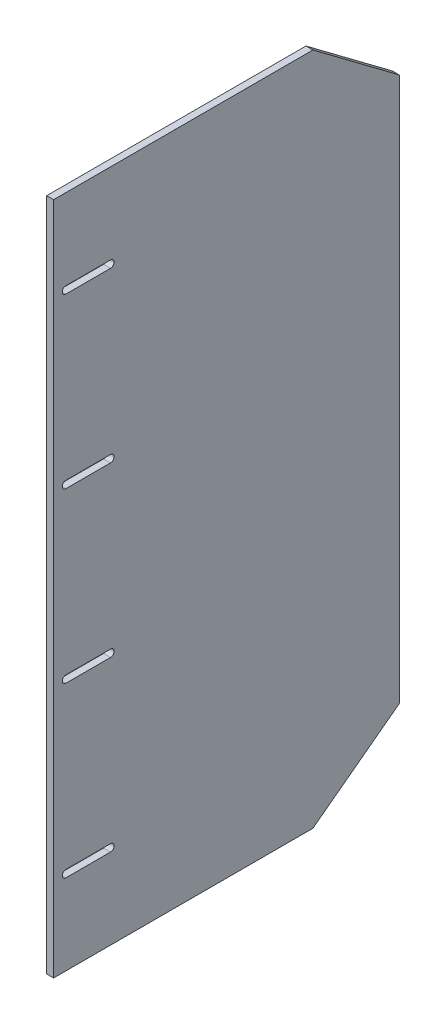
ISO-10303-21;
HEADER;
FILE_DESCRIPTION(('STEP AP214'),'2;1');
FILE_NAME('part.step','',(''),(''),'','','');
FILE_SCHEMA(('AUTOMOTIVE_DESIGN { 1 0 10303 214 1 1 1 1 }'));
ENDSEC;
DATA;
#1=APPLICATION_CONTEXT('core data for automotive mechanical design processes');
#2=APPLICATION_PROTOCOL_DEFINITION('international standard','automotive_design',2000,#1);
#3=PRODUCT_CONTEXT('',#1,'mechanical');
#4=PRODUCT('Part','Part','',(#3));
#5=PRODUCT_RELATED_PRODUCT_CATEGORY('part','',(#4));
#6=PRODUCT_DEFINITION_FORMATION('','',#4);
#7=PRODUCT_DEFINITION_CONTEXT('part definition',#1,'design');
#8=PRODUCT_DEFINITION('design','',#6,#7);
#9=PRODUCT_DEFINITION_SHAPE('','',#8);
#10=(LENGTH_UNIT() NAMED_UNIT(*) SI_UNIT(.MILLI.,.METRE.));
#11=(NAMED_UNIT(*) PLANE_ANGLE_UNIT() SI_UNIT($,.RADIAN.));
#12=(NAMED_UNIT(*) SI_UNIT($,.STERADIAN.) SOLID_ANGLE_UNIT());
#13=UNCERTAINTY_MEASURE_WITH_UNIT(LENGTH_MEASURE(1.E-05),#10,'distance_accuracy_value','');
#14=(GEOMETRIC_REPRESENTATION_CONTEXT(3) GLOBAL_UNCERTAINTY_ASSIGNED_CONTEXT((#13)) GLOBAL_UNIT_ASSIGNED_CONTEXT((#10,
#11,#12)) REPRESENTATION_CONTEXT('',''));
#15=CARTESIAN_POINT('',(0.,0.,0.));
#16=DIRECTION('',(0.,0.,1.));
#17=DIRECTION('',(1.,0.,0.));
#18=AXIS2_PLACEMENT_3D('',#15,#16,#17);
#19=CARTESIAN_POINT('',(4.,245.85,-2.6448481647683E-13));
#20=DIRECTION('',(0.,1.,0.));
#21=DIRECTION('',(0.,0.,1.));
#22=AXIS2_PLACEMENT_3D('',#19,#20,#21);
#23=PLANE('',#22);
#24=DIRECTION('',(0.,0.,-1.));
#25=VECTOR('',#24,1.);
#26=CARTESIAN_POINT('',(0.,245.85,-2.6448481647683E-13));
#27=LINE('',#26,#25);
#28=CARTESIAN_POINT('',(0.,245.85,142.9));
#29=VERTEX_POINT('',#28);
#30=CARTESIAN_POINT('',(0.,245.85,117.1));
#31=VERTEX_POINT('',#30);
#32=EDGE_CURVE('E265',#29,#31,#27,.T.);
#33=ORIENTED_EDGE('',*,*,#32,.T.);
#34=DIRECTION('',(-1.,0.,0.));
#35=VECTOR('',#34,1.);
#36=CARTESIAN_POINT('',(4.,245.85,117.1));
#37=LINE('',#36,#35);
#38=CARTESIAN_POINT('',(4.,245.85,117.1));
#39=VERTEX_POINT('',#38);
#40=EDGE_CURVE('E11',#39,#31,#37,.T.);
#41=ORIENTED_EDGE('',*,*,#40,.F.);
#42=DIRECTION('',(0.,0.,-1.));
#43=VECTOR('',#42,1.);
#44=CARTESIAN_POINT('',(4.,245.85,-2.6448481647683E-13));
#45=LINE('',#44,#43);
#46=CARTESIAN_POINT('',(4.,245.85,142.9));
#47=VERTEX_POINT('',#46);
#48=EDGE_CURVE('E200',#47,#39,#45,.T.);
#49=ORIENTED_EDGE('',*,*,#48,.F.);
#50=DIRECTION('',(-1.,0.,0.));
#51=VECTOR('',#50,1.);
#52=CARTESIAN_POINT('',(4.,245.85,142.9));
#53=LINE('',#52,#51);
#54=EDGE_CURVE('E273',#47,#29,#53,.T.);
#55=ORIENTED_EDGE('',*,*,#54,.T.);
#56=EDGE_LOOP('',(#33,#41,#49,#55));
#57=FACE_BOUND('',#56,.T.);
#58=ADVANCED_FACE('F39',(#57),#23,.F.);
#59=CARTESIAN_POINT('',(4.,243.75,117.1));
#60=DIRECTION('',(-1.,0.,0.));
#61=DIRECTION('',(0.,0.,1.));
#62=AXIS2_PLACEMENT_3D('',#59,#60,#61);
#63=CYLINDRICAL_SURFACE('',#62,2.09999999999999);
#64=CARTESIAN_POINT('',(0.,243.75,117.1));
#65=DIRECTION('',(1.,0.,0.));
#66=DIRECTION('',(0.,0.,-1.));
#67=AXIS2_PLACEMENT_3D('',#64,#65,#66);
#68=CIRCLE('',#67,2.09999999999999);
#69=CARTESIAN_POINT('',(0.,241.65,117.1));
#70=VERTEX_POINT('',#69);
#71=EDGE_CURVE('E206',#31,#70,#68,.F.);
#72=ORIENTED_EDGE('',*,*,#71,.T.);
#73=DIRECTION('',(-1.,0.,0.));
#74=VECTOR('',#73,1.);
#75=CARTESIAN_POINT('',(4.,241.65,117.1));
#76=LINE('',#75,#74);
#77=CARTESIAN_POINT('',(4.,241.65,117.1));
#78=VERTEX_POINT('',#77);
#79=EDGE_CURVE('E49',#78,#70,#76,.T.);
#80=ORIENTED_EDGE('',*,*,#79,.F.);
#81=CARTESIAN_POINT('',(4.,243.75,117.1));
#82=DIRECTION('',(1.,0.,0.));
#83=DIRECTION('',(0.,0.,-1.));
#84=AXIS2_PLACEMENT_3D('',#81,#82,#83);
#85=CIRCLE('',#84,2.09999999999999);
#86=EDGE_CURVE('E194',#39,#78,#85,.F.);
#87=ORIENTED_EDGE('',*,*,#86,.F.);
#88=ORIENTED_EDGE('',*,*,#40,.T.);
#89=EDGE_LOOP('',(#72,#80,#87,#88));
#90=FACE_BOUND('',#89,.T.);
#91=ADVANCED_FACE('F205',(#90),#63,.F.);
#92=CARTESIAN_POINT('',(4.,241.65,-2.59966466958007E-13));
#93=DIRECTION('',(0.,1.,0.));
#94=DIRECTION('',(0.,0.,1.));
#95=AXIS2_PLACEMENT_3D('',#92,#93,#94);
#96=PLANE('',#95);
#97=DIRECTION('',(0.,0.,-1.));
#98=VECTOR('',#97,1.);
#99=CARTESIAN_POINT('',(0.,241.65,-2.59966466958007E-13));
#100=LINE('',#99,#98);
#101=CARTESIAN_POINT('',(0.,241.65,142.9));
#102=VERTEX_POINT('',#101);
#103=EDGE_CURVE('E269',#102,#70,#100,.T.);
#104=ORIENTED_EDGE('',*,*,#103,.F.);
#105=DIRECTION('',(-1.,0.,0.));
#106=VECTOR('',#105,1.);
#107=CARTESIAN_POINT('',(4.,241.65,142.9));
#108=LINE('',#107,#106);
#109=CARTESIAN_POINT('',(4.,241.65,142.9));
#110=VERTEX_POINT('',#109);
#111=EDGE_CURVE('E128',#110,#102,#108,.T.);
#112=ORIENTED_EDGE('',*,*,#111,.F.);
#113=DIRECTION('',(0.,0.,-1.));
#114=VECTOR('',#113,1.);
#115=CARTESIAN_POINT('',(4.,241.65,-2.59966466958007E-13));
#116=LINE('',#115,#114);
#117=EDGE_CURVE('E198',#110,#78,#116,.T.);
#118=ORIENTED_EDGE('',*,*,#117,.T.);
#119=ORIENTED_EDGE('',*,*,#79,.T.);
#120=EDGE_LOOP('',(#104,#112,#118,#119));
#121=FACE_BOUND('',#120,.T.);
#122=ADVANCED_FACE('F211',(#121),#96,.T.);
#123=CARTESIAN_POINT('',(4.,50.85,0.));
#124=DIRECTION('',(0.,1.,0.));
#125=DIRECTION('',(0.,0.,1.));
#126=AXIS2_PLACEMENT_3D('',#123,#124,#125);
#127=PLANE('',#126);
#128=DIRECTION('',(0.,0.,-1.));
#129=VECTOR('',#128,1.);
#130=CARTESIAN_POINT('',(0.,50.85,0.));
#131=LINE('',#130,#129);
#132=CARTESIAN_POINT('',(0.,50.85,142.9));
#133=VERTEX_POINT('',#132);
#134=CARTESIAN_POINT('',(0.,50.85,117.099999999999));
#135=VERTEX_POINT('',#134);
#136=EDGE_CURVE('E254',#133,#135,#131,.T.);
#137=ORIENTED_EDGE('',*,*,#136,.T.);
#138=DIRECTION('',(-1.,0.,0.));
#139=VECTOR('',#138,1.);
#140=CARTESIAN_POINT('',(4.,50.85,117.099999999999));
#141=LINE('',#140,#139);
#142=CARTESIAN_POINT('',(4.,50.85,117.099999999999));
#143=VERTEX_POINT('',#142);
#144=EDGE_CURVE('E275',#143,#135,#141,.T.);
#145=ORIENTED_EDGE('',*,*,#144,.F.);
#146=DIRECTION('',(0.,0.,-1.));
#147=VECTOR('',#146,1.);
#148=CARTESIAN_POINT('',(4.,50.85,0.));
#149=LINE('',#148,#147);
#150=CARTESIAN_POINT('',(4.,50.85,142.9));
#151=VERTEX_POINT('',#150);
#152=EDGE_CURVE('E367',#151,#143,#149,.T.);
#153=ORIENTED_EDGE('',*,*,#152,.F.);
#154=DIRECTION('',(-1.,0.,0.));
#155=VECTOR('',#154,1.);
#156=CARTESIAN_POINT('',(4.,50.85,142.9));
#157=LINE('',#156,#155);
#158=EDGE_CURVE('E277',#151,#133,#157,.T.);
#159=ORIENTED_EDGE('',*,*,#158,.T.);
#160=EDGE_LOOP('',(#137,#145,#153,#159));
#161=FACE_BOUND('',#160,.T.);
#162=ADVANCED_FACE('F387',(#161),#127,.F.);
#163=CARTESIAN_POINT('',(4.,48.75,117.099999999999));
#164=DIRECTION('',(-1.,0.,0.));
#165=DIRECTION('',(0.,0.,1.));
#166=AXIS2_PLACEMENT_3D('',#163,#164,#165);
#167=CYLINDRICAL_SURFACE('',#166,2.09999999999999);
#168=CARTESIAN_POINT('',(0.,48.75,117.099999999999));
#169=DIRECTION('',(1.,0.,0.));
#170=DIRECTION('',(0.,0.,-1.));
#171=AXIS2_PLACEMENT_3D('',#168,#169,#170);
#172=CIRCLE('',#171,2.09999999999999);
#173=CARTESIAN_POINT('',(0.,46.65,117.099999999999));
#174=VERTEX_POINT('',#173);
#175=EDGE_CURVE('E257',#135,#174,#172,.F.);
#176=ORIENTED_EDGE('',*,*,#175,.T.);
#177=DIRECTION('',(-1.,0.,0.));
#178=VECTOR('',#177,1.);
#179=CARTESIAN_POINT('',(4.,46.65,117.099999999999));
#180=LINE('',#179,#178);
#181=CARTESIAN_POINT('',(4.,46.65,117.099999999999));
#182=VERTEX_POINT('',#181);
#183=EDGE_CURVE('E283',#182,#174,#180,.T.);
#184=ORIENTED_EDGE('',*,*,#183,.F.);
#185=CARTESIAN_POINT('',(4.,48.75,117.099999999999));
#186=DIRECTION('',(1.,0.,0.));
#187=DIRECTION('',(0.,0.,-1.));
#188=AXIS2_PLACEMENT_3D('',#185,#186,#187);
#189=CIRCLE('',#188,2.09999999999999);
#190=EDGE_CURVE('E370',#143,#182,#189,.F.);
#191=ORIENTED_EDGE('',*,*,#190,.F.);
#192=ORIENTED_EDGE('',*,*,#144,.T.);
#193=EDGE_LOOP('',(#176,#184,#191,#192));
#194=FACE_BOUND('',#193,.T.);
#195=ADVANCED_FACE('F389',(#194),#167,.F.);
#196=CARTESIAN_POINT('',(4.,46.6500000000001,0.));
#197=DIRECTION('',(0.,1.,0.));
#198=DIRECTION('',(0.,0.,1.));
#199=AXIS2_PLACEMENT_3D('',#196,#197,#198);
#200=PLANE('',#199);
#201=DIRECTION('',(0.,0.,-1.));
#202=VECTOR('',#201,1.);
#203=CARTESIAN_POINT('',(0.,46.6500000000001,0.));
#204=LINE('',#203,#202);
#205=CARTESIAN_POINT('',(0.,46.65,142.9));
#206=VERTEX_POINT('',#205);
#207=EDGE_CURVE('E260',#206,#174,#204,.T.);
#208=ORIENTED_EDGE('',*,*,#207,.F.);
#209=DIRECTION('',(-1.,0.,0.));
#210=VECTOR('',#209,1.);
#211=CARTESIAN_POINT('',(4.,46.65,142.9));
#212=LINE('',#211,#210);
#213=CARTESIAN_POINT('',(4.,46.65,142.9));
#214=VERTEX_POINT('',#213);
#215=EDGE_CURVE('E280',#214,#206,#212,.T.);
#216=ORIENTED_EDGE('',*,*,#215,.F.);
#217=DIRECTION('',(0.,0.,-1.));
#218=VECTOR('',#217,1.);
#219=CARTESIAN_POINT('',(4.,46.6500000000001,0.));
#220=LINE('',#219,#218);
#221=EDGE_CURVE('E372',#214,#182,#220,.T.);
#222=ORIENTED_EDGE('',*,*,#221,.T.);
#223=ORIENTED_EDGE('',*,*,#183,.T.);
#224=EDGE_LOOP('',(#208,#216,#222,#223));
#225=FACE_BOUND('',#224,.T.);
#226=ADVANCED_FACE('F393',(#225),#200,.T.);
#227=CARTESIAN_POINT('',(4.,0.,-50.));
#228=DIRECTION('',(0.,0.,1.));
#229=DIRECTION('',(1.,0.,0.));
#230=AXIS2_PLACEMENT_3D('',#227,#228,#229);
#231=PLANE('',#230);
#232=DIRECTION('',(0.,1.,0.));
#233=VECTOR('',#232,1.);
#234=CARTESIAN_POINT('',(0.,0.,-50.));
#235=LINE('',#234,#233);
#236=CARTESIAN_POINT('',(0.,37.5,-50.));
#237=VERTEX_POINT('',#236);
#238=CARTESIAN_POINT('',(0.,352.5,-50.));
#239=VERTEX_POINT('',#238);
#240=EDGE_CURVE('E241',#237,#239,#235,.T.);
#241=ORIENTED_EDGE('',*,*,#240,.T.);
#242=DIRECTION('',(-1.,0.,0.));
#243=VECTOR('',#242,1.);
#244=CARTESIAN_POINT('',(4.,352.5,-50.));
#245=LINE('',#244,#243);
#246=CARTESIAN_POINT('',(4.,352.5,-50.));
#247=VERTEX_POINT('',#246);
#248=EDGE_CURVE('E281',#247,#239,#245,.T.);
#249=ORIENTED_EDGE('',*,*,#248,.F.);
#250=DIRECTION('',(0.,1.,0.));
#251=VECTOR('',#250,1.);
#252=CARTESIAN_POINT('',(4.,0.,-50.));
#253=LINE('',#252,#251);
#254=CARTESIAN_POINT('',(4.,37.5,-50.));
#255=VERTEX_POINT('',#254);
#256=EDGE_CURVE('E354',#255,#247,#253,.T.);
#257=ORIENTED_EDGE('',*,*,#256,.F.);
#258=DIRECTION('',(-1.,0.,0.));
#259=VECTOR('',#258,1.);
#260=CARTESIAN_POINT('',(4.,37.5,-50.));
#261=LINE('',#260,#259);
#262=EDGE_CURVE('E287',#255,#237,#261,.T.);
#263=ORIENTED_EDGE('',*,*,#262,.T.);
#264=EDGE_LOOP('',(#241,#249,#257,#263));
#265=FACE_BOUND('',#264,.T.);
#266=ADVANCED_FACE('F423',(#265),#231,.F.);
#267=CARTESIAN_POINT('',(4.,249.6,-187.2));
#268=DIRECTION('',(0.,-0.8,0.6));
#269=DIRECTION('',(0.,-0.6,-0.8));
#270=AXIS2_PLACEMENT_3D('',#267,#268,#269);
#271=PLANE('',#270);
#272=DIRECTION('',(0.,0.6,0.8));
#273=VECTOR('',#272,1.);
#274=CARTESIAN_POINT('',(0.,249.6,-187.2));
#275=LINE('',#274,#273);
#276=CARTESIAN_POINT('',(0.,390.,0.));
#277=VERTEX_POINT('',#276);
#278=EDGE_CURVE('E244',#239,#277,#275,.T.);
#279=ORIENTED_EDGE('',*,*,#278,.T.);
#280=DIRECTION('',(-1.,0.,0.));
#281=VECTOR('',#280,1.);
#282=CARTESIAN_POINT('',(4.,390.,0.));
#283=LINE('',#282,#281);
#284=CARTESIAN_POINT('',(4.,390.,0.));
#285=VERTEX_POINT('',#284);
#286=EDGE_CURVE('E300',#285,#277,#283,.T.);
#287=ORIENTED_EDGE('',*,*,#286,.F.);
#288=DIRECTION('',(0.,0.6,0.8));
#289=VECTOR('',#288,1.);
#290=CARTESIAN_POINT('',(4.,249.6,-187.2));
#291=LINE('',#290,#289);
#292=EDGE_CURVE('E357',#247,#285,#291,.T.);
#293=ORIENTED_EDGE('',*,*,#292,.F.);
#294=ORIENTED_EDGE('',*,*,#248,.T.);
#295=EDGE_LOOP('',(#279,#287,#293,#294));
#296=FACE_BOUND('',#295,.T.);
#297=ADVANCED_FACE('F443',(#296),#271,.F.);
#298=CARTESIAN_POINT('',(4.,390.,0.));
#299=DIRECTION('',(0.,-1.,0.));
#300=DIRECTION('',(0.,0.,-1.));
#301=AXIS2_PLACEMENT_3D('',#298,#299,#300);
#302=PLANE('',#301);
#303=DIRECTION('',(0.,0.,1.));
#304=VECTOR('',#303,1.);
#305=CARTESIAN_POINT('',(0.,390.,0.));
#306=LINE('',#305,#304);
#307=CARTESIAN_POINT('',(0.,390.,150.));
#308=VERTEX_POINT('',#307);
#309=EDGE_CURVE('E246',#277,#308,#306,.T.);
#310=ORIENTED_EDGE('',*,*,#309,.T.);
#311=DIRECTION('',(-1.,0.,0.));
#312=VECTOR('',#311,1.);
#313=CARTESIAN_POINT('',(4.,390.,150.));
#314=LINE('',#313,#312);
#315=CARTESIAN_POINT('',(4.,390.,150.));
#316=VERTEX_POINT('',#315);
#317=EDGE_CURVE('E297',#316,#308,#314,.T.);
#318=ORIENTED_EDGE('',*,*,#317,.F.);
#319=DIRECTION('',(0.,0.,1.));
#320=VECTOR('',#319,1.);
#321=CARTESIAN_POINT('',(4.,390.,0.));
#322=LINE('',#321,#320);
#323=EDGE_CURVE('E359',#285,#316,#322,.T.);
#324=ORIENTED_EDGE('',*,*,#323,.F.);
#325=ORIENTED_EDGE('',*,*,#286,.T.);
#326=EDGE_LOOP('',(#310,#318,#324,#325));
#327=FACE_BOUND('',#326,.T.);
#328=ADVANCED_FACE('F439',(#327),#302,.F.);
#329=CARTESIAN_POINT('',(4.,0.,150.));
#330=DIRECTION('',(0.,0.,-1.));
#331=DIRECTION('',(-1.,0.,0.));
#332=AXIS2_PLACEMENT_3D('',#329,#330,#331);
#333=PLANE('',#332);
#334=DIRECTION('',(0.,-1.,0.));
#335=VECTOR('',#334,1.);
#336=CARTESIAN_POINT('',(0.,0.,150.));
#337=LINE('',#336,#335);
#338=CARTESIAN_POINT('',(0.,0.,150.));
#339=VERTEX_POINT('',#338);
#340=EDGE_CURVE('E248',#308,#339,#337,.T.);
#341=ORIENTED_EDGE('',*,*,#340,.T.);
#342=DIRECTION('',(-1.,0.,0.));
#343=VECTOR('',#342,1.);
#344=CARTESIAN_POINT('',(4.,0.,150.));
#345=LINE('',#344,#343);
#346=CARTESIAN_POINT('',(4.,0.,150.));
#347=VERTEX_POINT('',#346);
#348=EDGE_CURVE('E294',#347,#339,#345,.T.);
#349=ORIENTED_EDGE('',*,*,#348,.F.);
#350=DIRECTION('',(0.,-1.,0.));
#351=VECTOR('',#350,1.);
#352=CARTESIAN_POINT('',(4.,0.,150.));
#353=LINE('',#352,#351);
#354=EDGE_CURVE('E361',#316,#347,#353,.T.);
#355=ORIENTED_EDGE('',*,*,#354,.F.);
#356=ORIENTED_EDGE('',*,*,#317,.T.);
#357=EDGE_LOOP('',(#341,#349,#355,#356));
#358=FACE_BOUND('',#357,.T.);
#359=ADVANCED_FACE('F435',(#358),#333,.F.);
#360=CARTESIAN_POINT('',(4.,0.,0.));
#361=DIRECTION('',(0.,1.,0.));
#362=DIRECTION('',(0.,0.,1.));
#363=AXIS2_PLACEMENT_3D('',#360,#361,#362);
#364=PLANE('',#363);
#365=DIRECTION('',(0.,0.,-1.));
#366=VECTOR('',#365,1.);
#367=CARTESIAN_POINT('',(0.,0.,0.));
#368=LINE('',#367,#366);
#369=CARTESIAN_POINT('',(0.,0.,0.));
#370=VERTEX_POINT('',#369);
#371=EDGE_CURVE('E250',#339,#370,#368,.T.);
#372=ORIENTED_EDGE('',*,*,#371,.T.);
#373=DIRECTION('',(-1.,0.,0.));
#374=VECTOR('',#373,1.);
#375=CARTESIAN_POINT('',(4.,0.,0.));
#376=LINE('',#375,#374);
#377=CARTESIAN_POINT('',(4.,0.,0.));
#378=VERTEX_POINT('',#377);
#379=EDGE_CURVE('E290',#378,#370,#376,.T.);
#380=ORIENTED_EDGE('',*,*,#379,.F.);
#381=DIRECTION('',(0.,0.,-1.));
#382=VECTOR('',#381,1.);
#383=CARTESIAN_POINT('',(4.,0.,0.));
#384=LINE('',#383,#382);
#385=EDGE_CURVE('E363',#347,#378,#384,.T.);
#386=ORIENTED_EDGE('',*,*,#385,.F.);
#387=ORIENTED_EDGE('',*,*,#348,.T.);
#388=EDGE_LOOP('',(#372,#380,#386,#387));
#389=FACE_BOUND('',#388,.T.);
#390=ADVANCED_FACE('F431',(#389),#364,.F.);
#391=CARTESIAN_POINT('',(4.,146.25,117.1));
#392=DIRECTION('',(-1.,0.,0.));
#393=DIRECTION('',(0.,0.,1.));
#394=AXIS2_PLACEMENT_3D('',#391,#392,#393);
#395=CYLINDRICAL_SURFACE('',#394,2.09999999999999);
#396=CARTESIAN_POINT('',(0.,146.25,117.1));
#397=DIRECTION('',(1.,0.,0.));
#398=DIRECTION('',(0.,0.,-1.));
#399=AXIS2_PLACEMENT_3D('',#396,#397,#398);
#400=CIRCLE('',#399,2.09999999999999);
#401=CARTESIAN_POINT('',(0.,144.15,117.1));
#402=VERTEX_POINT('',#401);
#403=CARTESIAN_POINT('',(0.,148.35,117.1));
#404=VERTEX_POINT('',#403);
#405=EDGE_CURVE('E229',#402,#404,#400,.T.);
#406=ORIENTED_EDGE('',*,*,#405,.F.);
#407=DIRECTION('',(-1.,0.,0.));
#408=VECTOR('',#407,1.);
#409=CARTESIAN_POINT('',(4.,144.15,117.1));
#410=LINE('',#409,#408);
#411=CARTESIAN_POINT('',(4.,144.15,117.1));
#412=VERTEX_POINT('',#411);
#413=EDGE_CURVE('E291',#412,#402,#410,.T.);
#414=ORIENTED_EDGE('',*,*,#413,.F.);
#415=CARTESIAN_POINT('',(4.,146.25,117.1));
#416=DIRECTION('',(1.,0.,0.));
#417=DIRECTION('',(0.,0.,-1.));
#418=AXIS2_PLACEMENT_3D('',#415,#416,#417);
#419=CIRCLE('',#418,2.09999999999999);
#420=CARTESIAN_POINT('',(4.,148.35,117.1));
#421=VERTEX_POINT('',#420);
#422=EDGE_CURVE('E337',#412,#421,#419,.T.);
#423=ORIENTED_EDGE('',*,*,#422,.T.);
#424=DIRECTION('',(-1.,0.,0.));
#425=VECTOR('',#424,1.);
#426=CARTESIAN_POINT('',(4.,148.35,117.1));
#427=LINE('',#426,#425);
#428=EDGE_CURVE('E305',#421,#404,#427,.T.);
#429=ORIENTED_EDGE('',*,*,#428,.T.);
#430=EDGE_LOOP('',(#406,#414,#423,#429));
#431=FACE_BOUND('',#430,.T.);
#432=ADVANCED_FACE('F434',(#431),#395,.F.);
#433=CARTESIAN_POINT('',(4.,144.15,1.5507621027104E-13));
#434=DIRECTION('',(0.,1.,0.));
#435=DIRECTION('',(0.,0.,1.));
#436=AXIS2_PLACEMENT_3D('',#433,#434,#435);
#437=PLANE('',#436);
#438=DIRECTION('',(0.,0.,-1.));
#439=VECTOR('',#438,1.);
#440=CARTESIAN_POINT('',(0.,144.15,1.5507621027104E-13));
#441=LINE('',#440,#439);
#442=CARTESIAN_POINT('',(0.,144.15,142.9));
#443=VERTEX_POINT('',#442);
#444=EDGE_CURVE('E232',#443,#402,#441,.T.);
#445=ORIENTED_EDGE('',*,*,#444,.F.);
#446=DIRECTION('',(-1.,0.,0.));
#447=VECTOR('',#446,1.);
#448=CARTESIAN_POINT('',(4.,144.15,142.9));
#449=LINE('',#448,#447);
#450=CARTESIAN_POINT('',(4.,144.15,142.9));
#451=VERTEX_POINT('',#450);
#452=EDGE_CURVE('E309',#451,#443,#449,.T.);
#453=ORIENTED_EDGE('',*,*,#452,.F.);
#454=DIRECTION('',(0.,0.,-1.));
#455=VECTOR('',#454,1.);
#456=CARTESIAN_POINT('',(4.,144.15,1.5507621027104E-13));
#457=LINE('',#456,#455);
#458=EDGE_CURVE('E346',#451,#412,#457,.T.);
#459=ORIENTED_EDGE('',*,*,#458,.T.);
#460=ORIENTED_EDGE('',*,*,#413,.T.);
#461=EDGE_LOOP('',(#445,#453,#459,#460));
#462=FACE_BOUND('',#461,.T.);
#463=ADVANCED_FACE('F457',(#462),#437,.T.);
#464=CARTESIAN_POINT('',(4.,146.25,142.9));
#465=DIRECTION('',(-1.,0.,0.));
#466=DIRECTION('',(0.,0.,1.));
#467=AXIS2_PLACEMENT_3D('',#464,#465,#466);
#468=CYLINDRICAL_SURFACE('',#467,2.09999999999999);
#469=CARTESIAN_POINT('',(0.,146.25,142.9));
#470=DIRECTION('',(1.,0.,0.));
#471=DIRECTION('',(0.,0.,-1.));
#472=AXIS2_PLACEMENT_3D('',#469,#470,#471);
#473=CIRCLE('',#472,2.09999999999999);
#474=CARTESIAN_POINT('',(0.,148.35,142.9));
#475=VERTEX_POINT('',#474);
#476=EDGE_CURVE('E235',#475,#443,#473,.T.);
#477=ORIENTED_EDGE('',*,*,#476,.F.);
#478=DIRECTION('',(-1.,0.,0.));
#479=VECTOR('',#478,1.);
#480=CARTESIAN_POINT('',(4.,148.35,142.9));
#481=LINE('',#480,#479);
#482=CARTESIAN_POINT('',(4.,148.35,142.9));
#483=VERTEX_POINT('',#482);
#484=EDGE_CURVE('E307',#483,#475,#481,.T.);
#485=ORIENTED_EDGE('',*,*,#484,.F.);
#486=CARTESIAN_POINT('',(4.,146.25,142.9));
#487=DIRECTION('',(1.,0.,0.));
#488=DIRECTION('',(0.,0.,-1.));
#489=AXIS2_PLACEMENT_3D('',#486,#487,#488);
#490=CIRCLE('',#489,2.09999999999999);
#491=EDGE_CURVE('E349',#483,#451,#490,.T.);
#492=ORIENTED_EDGE('',*,*,#491,.T.);
#493=ORIENTED_EDGE('',*,*,#452,.T.);
#494=EDGE_LOOP('',(#477,#485,#492,#493));
#495=FACE_BOUND('',#494,.T.);
#496=ADVANCED_FACE('F454',(#495),#468,.F.);
#497=CARTESIAN_POINT('',(4.,341.25,117.099999999999));
#498=DIRECTION('',(-1.,0.,0.));
#499=DIRECTION('',(0.,0.,1.));
#500=AXIS2_PLACEMENT_3D('',#497,#498,#499);
#501=CYLINDRICAL_SURFACE('',#500,2.09999999999999);
#502=CARTESIAN_POINT('',(0.,341.25,117.099999999999));
#503=DIRECTION('',(1.,0.,0.));
#504=DIRECTION('',(0.,0.,-1.));
#505=AXIS2_PLACEMENT_3D('',#502,#503,#504);
#506=CIRCLE('',#505,2.09999999999999);
#507=CARTESIAN_POINT('',(0.,339.15,117.099999999999));
#508=VERTEX_POINT('',#507);
#509=CARTESIAN_POINT('',(0.,343.35,117.099999999999));
#510=VERTEX_POINT('',#509);
#511=EDGE_CURVE('E217',#508,#510,#506,.T.);
#512=ORIENTED_EDGE('',*,*,#511,.F.);
#513=DIRECTION('',(-1.,0.,0.));
#514=VECTOR('',#513,1.);
#515=CARTESIAN_POINT('',(4.,339.15,117.099999999999));
#516=LINE('',#515,#514);
#517=CARTESIAN_POINT('',(4.,339.15,117.099999999999));
#518=VERTEX_POINT('',#517);
#519=EDGE_CURVE('E43',#518,#508,#516,.T.);
#520=ORIENTED_EDGE('',*,*,#519,.F.);
#521=CARTESIAN_POINT('',(4.,341.25,117.099999999999));
#522=DIRECTION('',(1.,0.,0.));
#523=DIRECTION('',(0.,0.,-1.));
#524=AXIS2_PLACEMENT_3D('',#521,#522,#523);
#525=CIRCLE('',#524,2.09999999999999);
#526=CARTESIAN_POINT('',(4.,343.35,117.099999999999));
#527=VERTEX_POINT('',#526);
#528=EDGE_CURVE('E272',#518,#527,#525,.T.);
#529=ORIENTED_EDGE('',*,*,#528,.T.);
#530=DIRECTION('',(-1.,0.,0.));
#531=VECTOR('',#530,1.);
#532=CARTESIAN_POINT('',(4.,343.35,117.099999999999));
#533=LINE('',#532,#531);
#534=EDGE_CURVE('E213',#527,#510,#533,.T.);
#535=ORIENTED_EDGE('',*,*,#534,.T.);
#536=EDGE_LOOP('',(#512,#520,#529,#535));
#537=FACE_BOUND('',#536,.T.);
#538=ADVANCED_FACE('F41',(#537),#501,.F.);
#539=CARTESIAN_POINT('',(4.,339.15,0.));
#540=DIRECTION('',(0.,1.,0.));
#541=DIRECTION('',(0.,0.,1.));
#542=AXIS2_PLACEMENT_3D('',#539,#540,#541);
#543=PLANE('',#542);
#544=DIRECTION('',(0.,0.,-1.));
#545=VECTOR('',#544,1.);
#546=CARTESIAN_POINT('',(0.,339.15,0.));
#547=LINE('',#546,#545);
#548=CARTESIAN_POINT('',(0.,339.15,142.9));
#549=VERTEX_POINT('',#548);
#550=EDGE_CURVE('E220',#549,#508,#547,.T.);
#551=ORIENTED_EDGE('',*,*,#550,.F.);
#552=DIRECTION('',(-1.,0.,0.));
#553=VECTOR('',#552,1.);
#554=CARTESIAN_POINT('',(4.,339.15,142.9));
#555=LINE('',#554,#553);
#556=CARTESIAN_POINT('',(4.,339.15,142.9));
#557=VERTEX_POINT('',#556);
#558=EDGE_CURVE('E314',#557,#549,#555,.T.);
#559=ORIENTED_EDGE('',*,*,#558,.F.);
#560=DIRECTION('',(0.,0.,-1.));
#561=VECTOR('',#560,1.);
#562=CARTESIAN_POINT('',(4.,339.15,0.));
#563=LINE('',#562,#561);
#564=EDGE_CURVE('E323',#557,#518,#563,.T.);
#565=ORIENTED_EDGE('',*,*,#564,.T.);
#566=ORIENTED_EDGE('',*,*,#519,.T.);
#567=EDGE_LOOP('',(#551,#559,#565,#566));
#568=FACE_BOUND('',#567,.T.);
#569=ADVANCED_FACE('F321',(#568),#543,.T.);
#570=CARTESIAN_POINT('',(4.,341.25,142.9));
#571=DIRECTION('',(-1.,0.,0.));
#572=DIRECTION('',(0.,0.,1.));
#573=AXIS2_PLACEMENT_3D('',#570,#571,#572);
#574=CYLINDRICAL_SURFACE('',#573,2.09999999999999);
#575=CARTESIAN_POINT('',(0.,341.25,142.9));
#576=DIRECTION('',(1.,0.,0.));
#577=DIRECTION('',(0.,0.,-1.));
#578=AXIS2_PLACEMENT_3D('',#575,#576,#577);
#579=CIRCLE('',#578,2.09999999999999);
#580=CARTESIAN_POINT('',(0.,343.35,142.9));
#581=VERTEX_POINT('',#580);
#582=EDGE_CURVE('E223',#581,#549,#579,.T.);
#583=ORIENTED_EDGE('',*,*,#582,.F.);
#584=DIRECTION('',(-1.,0.,0.));
#585=VECTOR('',#584,1.);
#586=CARTESIAN_POINT('',(4.,343.35,142.9));
#587=LINE('',#586,#585);
#588=CARTESIAN_POINT('',(4.,343.35,142.9));
#589=VERTEX_POINT('',#588);
#590=EDGE_CURVE('E313',#589,#581,#587,.T.);
#591=ORIENTED_EDGE('',*,*,#590,.F.);
#592=CARTESIAN_POINT('',(4.,341.25,142.9));
#593=DIRECTION('',(1.,0.,0.));
#594=DIRECTION('',(0.,0.,-1.));
#595=AXIS2_PLACEMENT_3D('',#592,#593,#594);
#596=CIRCLE('',#595,2.09999999999999);
#597=EDGE_CURVE('E332',#589,#557,#596,.T.);
#598=ORIENTED_EDGE('',*,*,#597,.T.);
#599=ORIENTED_EDGE('',*,*,#558,.T.);
#600=EDGE_LOOP('',(#583,#591,#598,#599));
#601=FACE_BOUND('',#600,.T.);
#602=ADVANCED_FACE('F329',(#601),#574,.F.);
#603=CARTESIAN_POINT('',(4.,48.75,142.9));
#604=DIRECTION('',(-1.,0.,0.));
#605=DIRECTION('',(0.,0.,1.));
#606=AXIS2_PLACEMENT_3D('',#603,#604,#605);
#607=CYLINDRICAL_SURFACE('',#606,2.1);
#608=CARTESIAN_POINT('',(0.,48.75,142.9));
#609=DIRECTION('',(1.,0.,0.));
#610=DIRECTION('',(0.,0.,-1.));
#611=AXIS2_PLACEMENT_3D('',#608,#609,#610);
#612=CIRCLE('',#611,2.1);
#613=EDGE_CURVE('E263',#206,#133,#612,.F.);
#614=ORIENTED_EDGE('',*,*,#613,.T.);
#615=ORIENTED_EDGE('',*,*,#158,.F.);
#616=CARTESIAN_POINT('',(4.,48.75,142.9));
#617=DIRECTION('',(1.,0.,0.));
#618=DIRECTION('',(0.,0.,-1.));
#619=AXIS2_PLACEMENT_3D('',#616,#617,#618);
#620=CIRCLE('',#619,2.1);
#621=EDGE_CURVE('E375',#214,#151,#620,.F.);
#622=ORIENTED_EDGE('',*,*,#621,.F.);
#623=ORIENTED_EDGE('',*,*,#215,.T.);
#624=EDGE_LOOP('',(#614,#615,#622,#623));
#625=FACE_BOUND('',#624,.T.);
#626=ADVANCED_FACE('F383',(#625),#607,.F.);
#627=CARTESIAN_POINT('',(4.,0.,0.));
#628=DIRECTION('',(0.,0.8,0.6));
#629=DIRECTION('',(0.,-0.6,0.8));
#630=AXIS2_PLACEMENT_3D('',#627,#628,#629);
#631=PLANE('',#630);
#632=DIRECTION('',(0.,0.6,-0.8));
#633=VECTOR('',#632,1.);
#634=CARTESIAN_POINT('',(0.,0.,0.));
#635=LINE('',#634,#633);
#636=EDGE_CURVE('E252',#370,#237,#635,.T.);
#637=ORIENTED_EDGE('',*,*,#636,.T.);
#638=ORIENTED_EDGE('',*,*,#262,.F.);
#639=DIRECTION('',(0.,0.6,-0.8));
#640=VECTOR('',#639,1.);
#641=CARTESIAN_POINT('',(4.,0.,0.));
#642=LINE('',#641,#640);
#643=EDGE_CURVE('E365',#378,#255,#642,.T.);
#644=ORIENTED_EDGE('',*,*,#643,.F.);
#645=ORIENTED_EDGE('',*,*,#379,.T.);
#646=EDGE_LOOP('',(#637,#638,#644,#645));
#647=FACE_BOUND('',#646,.T.);
#648=ADVANCED_FACE('F420',(#647),#631,.F.);
#649=CARTESIAN_POINT('',(4.,148.35,1.59594559789863E-13));
#650=DIRECTION('',(0.,1.,0.));
#651=DIRECTION('',(0.,0.,1.));
#652=AXIS2_PLACEMENT_3D('',#649,#650,#651);
#653=PLANE('',#652);
#654=DIRECTION('',(0.,0.,-1.));
#655=VECTOR('',#654,1.);
#656=CARTESIAN_POINT('',(0.,148.35,1.59594559789863E-13));
#657=LINE('',#656,#655);
#658=EDGE_CURVE('E238',#475,#404,#657,.T.);
#659=ORIENTED_EDGE('',*,*,#658,.T.);
#660=ORIENTED_EDGE('',*,*,#428,.F.);
#661=DIRECTION('',(0.,0.,-1.));
#662=VECTOR('',#661,1.);
#663=CARTESIAN_POINT('',(4.,148.35,1.59594559789863E-13));
#664=LINE('',#663,#662);
#665=EDGE_CURVE('E352',#483,#421,#664,.T.);
#666=ORIENTED_EDGE('',*,*,#665,.F.);
#667=ORIENTED_EDGE('',*,*,#484,.T.);
#668=EDGE_LOOP('',(#659,#660,#666,#667));
#669=FACE_BOUND('',#668,.T.);
#670=ADVANCED_FACE('F408',(#669),#653,.F.);
#671=CARTESIAN_POINT('',(4.,343.35,0.));
#672=DIRECTION('',(0.,1.,0.));
#673=DIRECTION('',(0.,0.,1.));
#674=AXIS2_PLACEMENT_3D('',#671,#672,#673);
#675=PLANE('',#674);
#676=DIRECTION('',(0.,0.,-1.));
#677=VECTOR('',#676,1.);
#678=CARTESIAN_POINT('',(0.,343.35,0.));
#679=LINE('',#678,#677);
#680=EDGE_CURVE('E226',#581,#510,#679,.T.);
#681=ORIENTED_EDGE('',*,*,#680,.T.);
#682=ORIENTED_EDGE('',*,*,#534,.F.);
#683=DIRECTION('',(0.,0.,-1.));
#684=VECTOR('',#683,1.);
#685=CARTESIAN_POINT('',(4.,343.35,0.));
#686=LINE('',#685,#684);
#687=EDGE_CURVE('E334',#589,#527,#686,.T.);
#688=ORIENTED_EDGE('',*,*,#687,.F.);
#689=ORIENTED_EDGE('',*,*,#590,.T.);
#690=EDGE_LOOP('',(#681,#682,#688,#689));
#691=FACE_BOUND('',#690,.T.);
#692=ADVANCED_FACE('F335',(#691),#675,.F.);
#693=CARTESIAN_POINT('',(4.,243.75,142.9));
#694=DIRECTION('',(-1.,0.,0.));
#695=DIRECTION('',(0.,0.,1.));
#696=AXIS2_PLACEMENT_3D('',#693,#694,#695);
#697=CYLINDRICAL_SURFACE('',#696,2.09999999999999);
#698=CARTESIAN_POINT('',(0.,243.75,142.9));
#699=DIRECTION('',(1.,0.,0.));
#700=DIRECTION('',(0.,0.,-1.));
#701=AXIS2_PLACEMENT_3D('',#698,#699,#700);
#702=CIRCLE('',#701,2.09999999999999);
#703=EDGE_CURVE('E131',#102,#29,#702,.F.);
#704=ORIENTED_EDGE('',*,*,#703,.T.);
#705=ORIENTED_EDGE('',*,*,#54,.F.);
#706=CARTESIAN_POINT('',(4.,243.75,142.9));
#707=DIRECTION('',(1.,0.,0.));
#708=DIRECTION('',(0.,0.,-1.));
#709=AXIS2_PLACEMENT_3D('',#706,#707,#708);
#710=CIRCLE('',#709,2.09999999999999);
#711=EDGE_CURVE('E58',#110,#47,#710,.F.);
#712=ORIENTED_EDGE('',*,*,#711,.F.);
#713=ORIENTED_EDGE('',*,*,#111,.T.);
#714=EDGE_LOOP('',(#704,#705,#712,#713));
#715=FACE_BOUND('',#714,.T.);
#716=ADVANCED_FACE('F400',(#715),#697,.F.);
#717=CARTESIAN_POINT('',(4.,0.,0.));
#718=DIRECTION('',(1.,0.,0.));
#719=DIRECTION('',(0.,0.,-1.));
#720=AXIS2_PLACEMENT_3D('',#717,#718,#719);
#721=PLANE('',#720);
#722=ORIENTED_EDGE('',*,*,#528,.F.);
#723=ORIENTED_EDGE('',*,*,#564,.F.);
#724=ORIENTED_EDGE('',*,*,#597,.F.);
#725=ORIENTED_EDGE('',*,*,#687,.T.);
#726=EDGE_LOOP('',(#722,#723,#724,#725));
#727=FACE_BOUND('',#726,.T.);
#728=ORIENTED_EDGE('',*,*,#422,.F.);
#729=ORIENTED_EDGE('',*,*,#458,.F.);
#730=ORIENTED_EDGE('',*,*,#491,.F.);
#731=ORIENTED_EDGE('',*,*,#665,.T.);
#732=EDGE_LOOP('',(#728,#729,#730,#731));
#733=FACE_BOUND('',#732,.T.);
#734=ORIENTED_EDGE('',*,*,#256,.T.);
#735=ORIENTED_EDGE('',*,*,#292,.T.);
#736=ORIENTED_EDGE('',*,*,#323,.T.);
#737=ORIENTED_EDGE('',*,*,#354,.T.);
#738=ORIENTED_EDGE('',*,*,#385,.T.);
#739=ORIENTED_EDGE('',*,*,#643,.T.);
#740=EDGE_LOOP('',(#734,#735,#736,#737,#738,#739));
#741=FACE_BOUND('',#740,.T.);
#742=ORIENTED_EDGE('',*,*,#152,.T.);
#743=ORIENTED_EDGE('',*,*,#190,.T.);
#744=ORIENTED_EDGE('',*,*,#221,.F.);
#745=ORIENTED_EDGE('',*,*,#621,.T.);
#746=EDGE_LOOP('',(#742,#743,#744,#745));
#747=FACE_BOUND('',#746,.T.);
#748=ORIENTED_EDGE('',*,*,#48,.T.);
#749=ORIENTED_EDGE('',*,*,#86,.T.);
#750=ORIENTED_EDGE('',*,*,#117,.F.);
#751=ORIENTED_EDGE('',*,*,#711,.T.);
#752=EDGE_LOOP('',(#748,#749,#750,#751));
#753=FACE_BOUND('',#752,.T.);
#754=ADVANCED_FACE('F196',(#727,#733,#741,#747,#753),#721,.T.);
#755=CARTESIAN_POINT('',(0.,0.,0.));
#756=DIRECTION('',(1.,0.,0.));
#757=DIRECTION('',(0.,0.,-1.));
#758=AXIS2_PLACEMENT_3D('',#755,#756,#757);
#759=PLANE('',#758);
#760=ORIENTED_EDGE('',*,*,#511,.T.);
#761=ORIENTED_EDGE('',*,*,#680,.F.);
#762=ORIENTED_EDGE('',*,*,#582,.T.);
#763=ORIENTED_EDGE('',*,*,#550,.T.);
#764=EDGE_LOOP('',(#760,#761,#762,#763));
#765=FACE_BOUND('',#764,.T.);
#766=ORIENTED_EDGE('',*,*,#405,.T.);
#767=ORIENTED_EDGE('',*,*,#658,.F.);
#768=ORIENTED_EDGE('',*,*,#476,.T.);
#769=ORIENTED_EDGE('',*,*,#444,.T.);
#770=EDGE_LOOP('',(#766,#767,#768,#769));
#771=FACE_BOUND('',#770,.T.);
#772=ORIENTED_EDGE('',*,*,#240,.F.);
#773=ORIENTED_EDGE('',*,*,#636,.F.);
#774=ORIENTED_EDGE('',*,*,#371,.F.);
#775=ORIENTED_EDGE('',*,*,#340,.F.);
#776=ORIENTED_EDGE('',*,*,#309,.F.);
#777=ORIENTED_EDGE('',*,*,#278,.F.);
#778=EDGE_LOOP('',(#772,#773,#774,#775,#776,#777));
#779=FACE_BOUND('',#778,.T.);
#780=ORIENTED_EDGE('',*,*,#136,.F.);
#781=ORIENTED_EDGE('',*,*,#613,.F.);
#782=ORIENTED_EDGE('',*,*,#207,.T.);
#783=ORIENTED_EDGE('',*,*,#175,.F.);
#784=EDGE_LOOP('',(#780,#781,#782,#783));
#785=FACE_BOUND('',#784,.T.);
#786=ORIENTED_EDGE('',*,*,#32,.F.);
#787=ORIENTED_EDGE('',*,*,#703,.F.);
#788=ORIENTED_EDGE('',*,*,#103,.T.);
#789=ORIENTED_EDGE('',*,*,#71,.F.);
#790=EDGE_LOOP('',(#786,#787,#788,#789));
#791=FACE_BOUND('',#790,.T.);
#792=ADVANCED_FACE('F327',(#765,#771,#779,#785,#791),#759,.F.);
#793=CLOSED_SHELL('',(#58,#91,#122,#162,#195,#226,#266,#297,#328,#359,#390,#432,#463,#496,#538,
#569,#602,#626,#648,#670,#692,#716,#754,#792));
#794=MANIFOLD_SOLID_BREP('B2',#793);
#795=ADVANCED_BREP_SHAPE_REPRESENTATION('',(#18,#794),#14);
#796=SHAPE_DEFINITION_REPRESENTATION(#9,#795);
ENDSEC;
END-ISO-10303-21;
